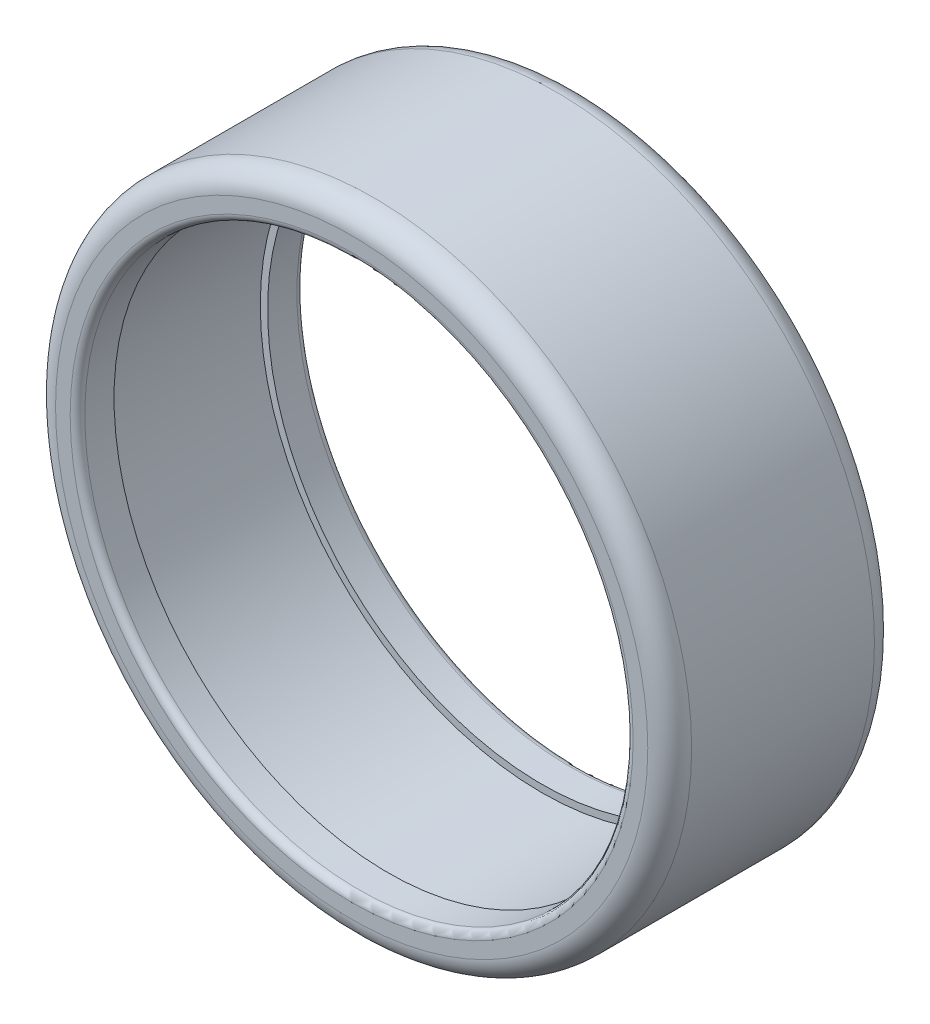
ISO-10303-21;
HEADER;
FILE_DESCRIPTION(('STEP AP214'),'2;1');
FILE_NAME('part.step','',(''),(''),'','','');
FILE_SCHEMA(('AUTOMOTIVE_DESIGN { 1 0 10303 214 1 1 1 1 }'));
ENDSEC;
DATA;
#1=APPLICATION_CONTEXT('core data for automotive mechanical design processes');
#2=APPLICATION_PROTOCOL_DEFINITION('international standard','automotive_design',2000,#1);
#3=PRODUCT_CONTEXT('',#1,'mechanical');
#4=PRODUCT('Part','Part','',(#3));
#5=PRODUCT_RELATED_PRODUCT_CATEGORY('part','',(#4));
#6=PRODUCT_DEFINITION_FORMATION('','',#4);
#7=PRODUCT_DEFINITION_CONTEXT('part definition',#1,'design');
#8=PRODUCT_DEFINITION('design','',#6,#7);
#9=PRODUCT_DEFINITION_SHAPE('','',#8);
#10=(LENGTH_UNIT() NAMED_UNIT(*) SI_UNIT(.MILLI.,.METRE.));
#11=(NAMED_UNIT(*) PLANE_ANGLE_UNIT() SI_UNIT($,.RADIAN.));
#12=(NAMED_UNIT(*) SI_UNIT($,.STERADIAN.) SOLID_ANGLE_UNIT());
#13=UNCERTAINTY_MEASURE_WITH_UNIT(LENGTH_MEASURE(1.E-05),#10,'distance_accuracy_value','');
#14=(GEOMETRIC_REPRESENTATION_CONTEXT(3) GLOBAL_UNCERTAINTY_ASSIGNED_CONTEXT((#13)) GLOBAL_UNIT_ASSIGNED_CONTEXT((#10,
#11,#12)) REPRESENTATION_CONTEXT('',''));
#15=CARTESIAN_POINT('',(0.,0.,0.));
#16=DIRECTION('',(0.,0.,1.));
#17=DIRECTION('',(1.,0.,0.));
#18=AXIS2_PLACEMENT_3D('',#15,#16,#17);
#19=CARTESIAN_POINT('',(0.,0.,31.));
#20=DIRECTION('',(0.,0.,-1.));
#21=DIRECTION('',(-1.,0.,0.));
#22=AXIS2_PLACEMENT_3D('',#19,#20,#21);
#23=CYLINDRICAL_SURFACE('',#22,37.5);
#24=CARTESIAN_POINT('',(0.,0.,30.));
#25=DIRECTION('',(0.,0.,1.));
#26=DIRECTION('',(1.,0.,0.));
#27=AXIS2_PLACEMENT_3D('',#24,#25,#26);
#28=CIRCLE('',#27,37.5);
#29=CARTESIAN_POINT('',(37.5,0.,30.));
#30=VERTEX_POINT('',#29);
#31=EDGE_CURVE('E57',#30,#30,#28,.T.);
#32=ORIENTED_EDGE('',*,*,#31,.T.);
#33=EDGE_LOOP('',(#32));
#34=FACE_BOUND('',#33,.T.);
#35=CARTESIAN_POINT('',(0.,0.,26.));
#36=DIRECTION('',(0.,0.,1.));
#37=DIRECTION('',(1.,0.,0.));
#38=AXIS2_PLACEMENT_3D('',#35,#36,#37);
#39=CIRCLE('',#38,37.5);
#40=CARTESIAN_POINT('',(37.5,0.,26.));
#41=VERTEX_POINT('',#40);
#42=EDGE_CURVE('E82',#41,#41,#39,.F.);
#43=ORIENTED_EDGE('',*,*,#42,.T.);
#44=EDGE_LOOP('',(#43));
#45=FACE_BOUND('',#44,.T.);
#46=ADVANCED_FACE('F46',(#34,#45),#23,.F.);
#47=CARTESIAN_POINT('',(0.,0.,31.));
#48=DIRECTION('',(0.,0.,1.));
#49=DIRECTION('',(1.,0.,0.));
#50=AXIS2_PLACEMENT_3D('',#47,#48,#49);
#51=PLANE('',#50);
#52=CARTESIAN_POINT('',(0.,0.,31.));
#53=DIRECTION('',(0.,0.,1.));
#54=DIRECTION('',(1.,0.,0.));
#55=AXIS2_PLACEMENT_3D('',#52,#53,#54);
#56=CIRCLE('',#55,38.5);
#57=CARTESIAN_POINT('',(38.5,0.,31.));
#58=VERTEX_POINT('',#57);
#59=EDGE_CURVE('E11',#58,#58,#56,.F.);
#60=ORIENTED_EDGE('',*,*,#59,.T.);
#61=EDGE_LOOP('',(#60));
#62=FACE_BOUND('',#61,.T.);
#63=CARTESIAN_POINT('',(0.,0.,31.));
#64=DIRECTION('',(0.,0.,1.));
#65=DIRECTION('',(1.,0.,0.));
#66=AXIS2_PLACEMENT_3D('',#63,#64,#65);
#67=CIRCLE('',#66,40.5);
#68=CARTESIAN_POINT('',(40.5,0.,31.));
#69=VERTEX_POINT('',#68);
#70=EDGE_CURVE('E66',#69,#69,#67,.T.);
#71=ORIENTED_EDGE('',*,*,#70,.T.);
#72=EDGE_LOOP('',(#71));
#73=FACE_BOUND('',#72,.T.);
#74=ADVANCED_FACE('F105',(#62,#73),#51,.T.);
#75=CARTESIAN_POINT('',(0.,0.,0.));
#76=DIRECTION('',(0.,0.,1.));
#77=DIRECTION('',(1.,0.,0.));
#78=AXIS2_PLACEMENT_3D('',#75,#76,#77);
#79=PLANE('',#78);
#80=CARTESIAN_POINT('',(0.,0.,0.));
#81=DIRECTION('',(0.,0.,1.));
#82=DIRECTION('',(1.,0.,0.));
#83=AXIS2_PLACEMENT_3D('',#80,#81,#82);
#84=CIRCLE('',#83,38.5);
#85=CARTESIAN_POINT('',(38.5,0.,0.));
#86=VERTEX_POINT('',#85);
#87=EDGE_CURVE('E61',#86,#86,#84,.T.);
#88=ORIENTED_EDGE('',*,*,#87,.T.);
#89=EDGE_LOOP('',(#88));
#90=FACE_BOUND('',#89,.T.);
#91=CARTESIAN_POINT('',(0.,0.,0.));
#92=DIRECTION('',(0.,0.,1.));
#93=DIRECTION('',(1.,0.,0.));
#94=AXIS2_PLACEMENT_3D('',#91,#92,#93);
#95=CIRCLE('',#94,40.5);
#96=CARTESIAN_POINT('',(40.5,0.,0.));
#97=VERTEX_POINT('',#96);
#98=EDGE_CURVE('E69',#97,#97,#95,.F.);
#99=ORIENTED_EDGE('',*,*,#98,.T.);
#100=EDGE_LOOP('',(#99));
#101=FACE_BOUND('',#100,.T.);
#102=ADVANCED_FACE('F111',(#90,#101),#79,.F.);
#103=CARTESIAN_POINT('',(0.,0.,31.));
#104=DIRECTION('',(0.,0.,-1.));
#105=DIRECTION('',(-1.,0.,0.));
#106=AXIS2_PLACEMENT_3D('',#103,#104,#105);
#107=CYLINDRICAL_SURFACE('',#106,43.5);
#108=CARTESIAN_POINT('',(0.,0.,3.));
#109=DIRECTION('',(0.,0.,1.));
#110=DIRECTION('',(1.,0.,0.));
#111=AXIS2_PLACEMENT_3D('',#108,#109,#110);
#112=CIRCLE('',#111,43.5);
#113=CARTESIAN_POINT('',(43.5,0.,3.));
#114=VERTEX_POINT('',#113);
#115=EDGE_CURVE('E72',#114,#114,#112,.T.);
#116=ORIENTED_EDGE('',*,*,#115,.T.);
#117=EDGE_LOOP('',(#116));
#118=FACE_BOUND('',#117,.T.);
#119=CARTESIAN_POINT('',(0.,0.,28.));
#120=DIRECTION('',(0.,0.,1.));
#121=DIRECTION('',(1.,0.,0.));
#122=AXIS2_PLACEMENT_3D('',#119,#120,#121);
#123=CIRCLE('',#122,43.5);
#124=CARTESIAN_POINT('',(43.5,0.,28.));
#125=VERTEX_POINT('',#124);
#126=EDGE_CURVE('E75',#125,#125,#123,.F.);
#127=ORIENTED_EDGE('',*,*,#126,.T.);
#128=EDGE_LOOP('',(#127));
#129=FACE_BOUND('',#128,.T.);
#130=ADVANCED_FACE('F116',(#118,#129),#107,.T.);
#131=CARTESIAN_POINT('',(0.,0.,5.));
#132=DIRECTION('',(0.,0.,1.));
#133=DIRECTION('',(1.,0.,0.));
#134=AXIS2_PLACEMENT_3D('',#131,#132,#133);
#135=CIRCLE('',#134,37.5);
#136=CARTESIAN_POINT('',(37.5,0.,5.));
#137=VERTEX_POINT('',#136);
#138=EDGE_CURVE('E79',#137,#137,#135,.F.);
#139=ORIENTED_EDGE('',*,*,#138,.F.);
#140=EDGE_LOOP('',(#139));
#141=FACE_BOUND('',#140,.T.);
#142=CARTESIAN_POINT('',(0.,0.,1.));
#143=DIRECTION('',(0.,0.,1.));
#144=DIRECTION('',(1.,0.,0.));
#145=AXIS2_PLACEMENT_3D('',#142,#143,#144);
#146=CIRCLE('',#145,37.5);
#147=CARTESIAN_POINT('',(37.5,0.,1.));
#148=VERTEX_POINT('',#147);
#149=EDGE_CURVE('E53',#148,#148,#146,.F.);
#150=ORIENTED_EDGE('',*,*,#149,.T.);
#151=EDGE_LOOP('',(#150));
#152=FACE_BOUND('',#151,.T.);
#153=ADVANCED_FACE('F107',(#141,#152),#23,.F.);
#154=CARTESIAN_POINT('',(0.,0.,3.));
#155=DIRECTION('',(0.,0.,1.));
#156=DIRECTION('',(1.,0.,0.));
#157=AXIS2_PLACEMENT_3D('',#154,#155,#156);
#158=TOROIDAL_SURFACE('',#157,40.5,3.);
#159=ORIENTED_EDGE('',*,*,#98,.F.);
#160=EDGE_LOOP('',(#159));
#161=FACE_BOUND('',#160,.T.);
#162=ORIENTED_EDGE('',*,*,#115,.F.);
#163=EDGE_LOOP('',(#162));
#164=FACE_BOUND('',#163,.T.);
#165=ADVANCED_FACE('F115',(#161,#164),#158,.T.);
#166=CARTESIAN_POINT('',(0.,0.,28.));
#167=DIRECTION('',(0.,0.,1.));
#168=DIRECTION('',(1.,0.,0.));
#169=AXIS2_PLACEMENT_3D('',#166,#167,#168);
#170=TOROIDAL_SURFACE('',#169,40.5,3.);
#171=ORIENTED_EDGE('',*,*,#126,.F.);
#172=EDGE_LOOP('',(#171));
#173=FACE_BOUND('',#172,.T.);
#174=ORIENTED_EDGE('',*,*,#70,.F.);
#175=EDGE_LOOP('',(#174));
#176=FACE_BOUND('',#175,.T.);
#177=ADVANCED_FACE('F122',(#173,#176),#170,.T.);
#178=CARTESIAN_POINT('',(0.,0.,1.));
#179=DIRECTION('',(0.,0.,1.));
#180=DIRECTION('',(1.,0.,0.));
#181=AXIS2_PLACEMENT_3D('',#178,#179,#180);
#182=TOROIDAL_SURFACE('',#181,38.5,1.);
#183=ORIENTED_EDGE('',*,*,#149,.F.);
#184=EDGE_LOOP('',(#183));
#185=FACE_BOUND('',#184,.T.);
#186=ORIENTED_EDGE('',*,*,#87,.F.);
#187=EDGE_LOOP('',(#186));
#188=FACE_BOUND('',#187,.T.);
#189=ADVANCED_FACE('F137',(#185,#188),#182,.T.);
#190=CARTESIAN_POINT('',(0.,0.,30.));
#191=DIRECTION('',(0.,0.,1.));
#192=DIRECTION('',(1.,0.,0.));
#193=AXIS2_PLACEMENT_3D('',#190,#191,#192);
#194=TOROIDAL_SURFACE('',#193,38.5,1.);
#195=ORIENTED_EDGE('',*,*,#59,.F.);
#196=EDGE_LOOP('',(#195));
#197=FACE_BOUND('',#196,.T.);
#198=ORIENTED_EDGE('',*,*,#31,.F.);
#199=EDGE_LOOP('',(#198));
#200=FACE_BOUND('',#199,.T.);
#201=ADVANCED_FACE('F48',(#197,#200),#194,.T.);
#202=CARTESIAN_POINT('',(0.,0.,26.));
#203=DIRECTION('',(0.,0.,1.));
#204=DIRECTION('',(1.,0.,0.));
#205=AXIS2_PLACEMENT_3D('',#202,#203,#204);
#206=PLANE('',#205);
#207=ORIENTED_EDGE('',*,*,#42,.F.);
#208=EDGE_LOOP('',(#207));
#209=FACE_BOUND('',#208,.T.);
#210=CARTESIAN_POINT('',(0.,0.,26.));
#211=DIRECTION('',(0.,0.,1.));
#212=DIRECTION('',(1.,0.,0.));
#213=AXIS2_PLACEMENT_3D('',#210,#211,#212);
#214=CIRCLE('',#213,38.5);
#215=CARTESIAN_POINT('',(38.5,0.,26.));
#216=VERTEX_POINT('',#215);
#217=EDGE_CURVE('E83',#216,#216,#214,.F.);
#218=ORIENTED_EDGE('',*,*,#217,.T.);
#219=EDGE_LOOP('',(#218));
#220=FACE_BOUND('',#219,.T.);
#221=ADVANCED_FACE('F91',(#209,#220),#206,.F.);
#222=CARTESIAN_POINT('',(0.,0.,5.));
#223=DIRECTION('',(0.,0.,1.));
#224=DIRECTION('',(1.,0.,0.));
#225=AXIS2_PLACEMENT_3D('',#222,#223,#224);
#226=PLANE('',#225);
#227=CARTESIAN_POINT('',(0.,0.,5.));
#228=DIRECTION('',(0.,0.,1.));
#229=DIRECTION('',(1.,0.,0.));
#230=AXIS2_PLACEMENT_3D('',#227,#228,#229);
#231=CIRCLE('',#230,38.5);
#232=CARTESIAN_POINT('',(38.5,0.,5.));
#233=VERTEX_POINT('',#232);
#234=EDGE_CURVE('E78',#233,#233,#231,.F.);
#235=ORIENTED_EDGE('',*,*,#234,.F.);
#236=EDGE_LOOP('',(#235));
#237=FACE_BOUND('',#236,.T.);
#238=ORIENTED_EDGE('',*,*,#138,.T.);
#239=EDGE_LOOP('',(#238));
#240=FACE_BOUND('',#239,.T.);
#241=ADVANCED_FACE('F95',(#237,#240),#226,.T.);
#242=CARTESIAN_POINT('',(0.,0.,31.));
#243=DIRECTION('',(0.,0.,-1.));
#244=DIRECTION('',(-1.,0.,0.));
#245=AXIS2_PLACEMENT_3D('',#242,#243,#244);
#246=CYLINDRICAL_SURFACE('',#245,38.5);
#247=ORIENTED_EDGE('',*,*,#234,.T.);
#248=EDGE_LOOP('',(#247));
#249=FACE_BOUND('',#248,.T.);
#250=ORIENTED_EDGE('',*,*,#217,.F.);
#251=EDGE_LOOP('',(#250));
#252=FACE_BOUND('',#251,.T.);
#253=ADVANCED_FACE('F93',(#249,#252),#246,.F.);
#254=CLOSED_SHELL('',(#46,#74,#102,#130,#153,#165,#177,#189,#201,#221,#241,#253));
#255=MANIFOLD_SOLID_BREP('B2',#254);
#256=ADVANCED_BREP_SHAPE_REPRESENTATION('',(#18,#255),#14);
#257=SHAPE_DEFINITION_REPRESENTATION(#9,#256);
ENDSEC;
END-ISO-10303-21;
